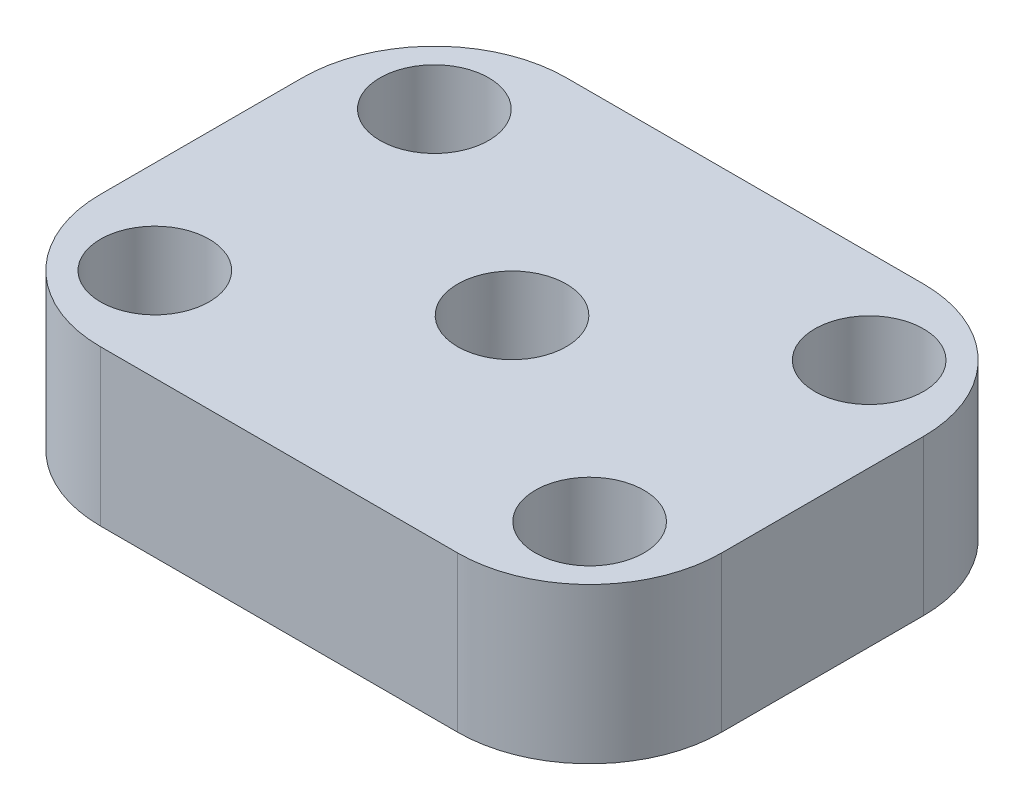
ISO-10303-21;
HEADER;
FILE_DESCRIPTION(('STEP AP214'),'2;1');
FILE_NAME('part.step','',(''),(''),'','','');
FILE_SCHEMA(('AUTOMOTIVE_DESIGN { 1 0 10303 214 1 1 1 1 }'));
ENDSEC;
DATA;
#1=APPLICATION_CONTEXT('core data for automotive mechanical design processes');
#2=APPLICATION_PROTOCOL_DEFINITION('international standard','automotive_design',2000,#1);
#3=PRODUCT_CONTEXT('',#1,'mechanical');
#4=PRODUCT('Part','Part','',(#3));
#5=PRODUCT_RELATED_PRODUCT_CATEGORY('part','',(#4));
#6=PRODUCT_DEFINITION_FORMATION('','',#4);
#7=PRODUCT_DEFINITION_CONTEXT('part definition',#1,'design');
#8=PRODUCT_DEFINITION('design','',#6,#7);
#9=PRODUCT_DEFINITION_SHAPE('','',#8);
#10=(LENGTH_UNIT() NAMED_UNIT(*) SI_UNIT(.MILLI.,.METRE.));
#11=(NAMED_UNIT(*) PLANE_ANGLE_UNIT() SI_UNIT($,.RADIAN.));
#12=(NAMED_UNIT(*) SI_UNIT($,.STERADIAN.) SOLID_ANGLE_UNIT());
#13=UNCERTAINTY_MEASURE_WITH_UNIT(LENGTH_MEASURE(1.E-05),#10,'distance_accuracy_value','');
#14=(GEOMETRIC_REPRESENTATION_CONTEXT(3) GLOBAL_UNCERTAINTY_ASSIGNED_CONTEXT((#13)) GLOBAL_UNIT_ASSIGNED_CONTEXT((#10,
#11,#12)) REPRESENTATION_CONTEXT('',''));
#15=CARTESIAN_POINT('',(0.,0.,0.));
#16=DIRECTION('',(0.,0.,1.));
#17=DIRECTION('',(1.,0.,0.));
#18=AXIS2_PLACEMENT_3D('',#15,#16,#17);
#19=CARTESIAN_POINT('',(14.,10.,-9.));
#20=DIRECTION('',(0.,1.,0.));
#21=DIRECTION('',(0.,0.,1.));
#22=AXIS2_PLACEMENT_3D('',#19,#20,#21);
#23=CYLINDRICAL_SURFACE('',#22,1.5);
#24=CARTESIAN_POINT('',(14.,0.,-9.));
#25=DIRECTION('',(0.,1.,0.));
#26=DIRECTION('',(0.,0.,1.));
#27=AXIS2_PLACEMENT_3D('',#24,#25,#26);
#28=CIRCLE('',#27,1.5);
#29=CARTESIAN_POINT('',(14.,0.,-7.5));
#30=VERTEX_POINT('',#29);
#31=EDGE_CURVE('E194',#30,#30,#28,.T.);
#32=ORIENTED_EDGE('',*,*,#31,.F.);
#33=EDGE_LOOP('',(#32));
#34=FACE_BOUND('',#33,.T.);
#35=CARTESIAN_POINT('',(14.,5.,-9.));
#36=DIRECTION('',(0.,1.,0.));
#37=DIRECTION('',(0.,0.,1.));
#38=AXIS2_PLACEMENT_3D('',#35,#36,#37);
#39=CIRCLE('',#38,1.5);
#40=CARTESIAN_POINT('',(14.,5.,-7.5));
#41=VERTEX_POINT('',#40);
#42=EDGE_CURVE('E37',#41,#41,#39,.F.);
#43=ORIENTED_EDGE('',*,*,#42,.F.);
#44=EDGE_LOOP('',(#43));
#45=FACE_BOUND('',#44,.T.);
#46=ADVANCED_FACE('F33',(#34,#45),#23,.F.);
#47=CARTESIAN_POINT('',(14.,10.,9.));
#48=DIRECTION('',(0.,1.,0.));
#49=DIRECTION('',(0.,0.,1.));
#50=AXIS2_PLACEMENT_3D('',#47,#48,#49);
#51=CYLINDRICAL_SURFACE('',#50,1.5);
#52=CARTESIAN_POINT('',(14.,0.,9.));
#53=DIRECTION('',(0.,1.,0.));
#54=DIRECTION('',(0.,0.,1.));
#55=AXIS2_PLACEMENT_3D('',#52,#53,#54);
#56=CIRCLE('',#55,1.5);
#57=CARTESIAN_POINT('',(14.,0.,10.5));
#58=VERTEX_POINT('',#57);
#59=EDGE_CURVE('E186',#58,#58,#56,.T.);
#60=ORIENTED_EDGE('',*,*,#59,.F.);
#61=EDGE_LOOP('',(#60));
#62=FACE_BOUND('',#61,.T.);
#63=CARTESIAN_POINT('',(14.,5.,9.));
#64=DIRECTION('',(0.,1.,0.));
#65=DIRECTION('',(0.,0.,1.));
#66=AXIS2_PLACEMENT_3D('',#63,#64,#65);
#67=CIRCLE('',#66,1.5);
#68=CARTESIAN_POINT('',(14.,5.,10.5));
#69=VERTEX_POINT('',#68);
#70=EDGE_CURVE('E172',#69,#69,#67,.F.);
#71=ORIENTED_EDGE('',*,*,#70,.F.);
#72=EDGE_LOOP('',(#71));
#73=FACE_BOUND('',#72,.T.);
#74=ADVANCED_FACE('F237',(#62,#73),#51,.F.);
#75=CARTESIAN_POINT('',(-14.,10.,9.));
#76=DIRECTION('',(0.,1.,0.));
#77=DIRECTION('',(0.,0.,1.));
#78=AXIS2_PLACEMENT_3D('',#75,#76,#77);
#79=CYLINDRICAL_SURFACE('',#78,1.5);
#80=CARTESIAN_POINT('',(-14.,0.,9.));
#81=DIRECTION('',(0.,1.,0.));
#82=DIRECTION('',(0.,0.,1.));
#83=AXIS2_PLACEMENT_3D('',#80,#81,#82);
#84=CIRCLE('',#83,1.5);
#85=CARTESIAN_POINT('',(-14.,0.,10.5));
#86=VERTEX_POINT('',#85);
#87=EDGE_CURVE('E181',#86,#86,#84,.T.);
#88=ORIENTED_EDGE('',*,*,#87,.F.);
#89=EDGE_LOOP('',(#88));
#90=FACE_BOUND('',#89,.T.);
#91=CARTESIAN_POINT('',(-14.,5.,9.));
#92=DIRECTION('',(0.,1.,0.));
#93=DIRECTION('',(0.,0.,1.));
#94=AXIS2_PLACEMENT_3D('',#91,#92,#93);
#95=CIRCLE('',#94,1.5);
#96=CARTESIAN_POINT('',(-14.,5.,10.5));
#97=VERTEX_POINT('',#96);
#98=EDGE_CURVE('E169',#97,#97,#95,.F.);
#99=ORIENTED_EDGE('',*,*,#98,.F.);
#100=EDGE_LOOP('',(#99));
#101=FACE_BOUND('',#100,.T.);
#102=ADVANCED_FACE('F243',(#90,#101),#79,.F.);
#103=CARTESIAN_POINT('',(-14.,10.,-9.));
#104=DIRECTION('',(0.,1.,0.));
#105=DIRECTION('',(0.,0.,1.));
#106=AXIS2_PLACEMENT_3D('',#103,#104,#105);
#107=CYLINDRICAL_SURFACE('',#106,1.5);
#108=CARTESIAN_POINT('',(-14.,0.,-9.));
#109=DIRECTION('',(0.,1.,0.));
#110=DIRECTION('',(0.,0.,1.));
#111=AXIS2_PLACEMENT_3D('',#108,#109,#110);
#112=CIRCLE('',#111,1.5);
#113=CARTESIAN_POINT('',(-14.,0.,-7.5));
#114=VERTEX_POINT('',#113);
#115=EDGE_CURVE('E177',#114,#114,#112,.T.);
#116=ORIENTED_EDGE('',*,*,#115,.F.);
#117=EDGE_LOOP('',(#116));
#118=FACE_BOUND('',#117,.T.);
#119=CARTESIAN_POINT('',(-14.,5.,-9.));
#120=DIRECTION('',(0.,1.,0.));
#121=DIRECTION('',(0.,0.,1.));
#122=AXIS2_PLACEMENT_3D('',#119,#120,#121);
#123=CIRCLE('',#122,1.5);
#124=CARTESIAN_POINT('',(-14.,5.,-7.5));
#125=VERTEX_POINT('',#124);
#126=EDGE_CURVE('E166',#125,#125,#123,.F.);
#127=ORIENTED_EDGE('',*,*,#126,.F.);
#128=EDGE_LOOP('',(#127));
#129=FACE_BOUND('',#128,.T.);
#130=ADVANCED_FACE('F275',(#118,#129),#107,.F.);
#131=CARTESIAN_POINT('',(20.,10.,-15.));
#132=DIRECTION('',(-1.,0.,0.));
#133=DIRECTION('',(0.,0.,1.));
#134=AXIS2_PLACEMENT_3D('',#131,#132,#133);
#135=PLANE('',#134);
#136=DIRECTION('',(0.,0.,-1.));
#137=VECTOR('',#136,1.);
#138=CARTESIAN_POINT('',(20.,0.,-15.));
#139=LINE('',#138,#137);
#140=CARTESIAN_POINT('',(20.,0.,6.5));
#141=VERTEX_POINT('',#140);
#142=CARTESIAN_POINT('',(20.,0.,-6.5));
#143=VERTEX_POINT('',#142);
#144=EDGE_CURVE('E128',#141,#143,#139,.T.);
#145=ORIENTED_EDGE('',*,*,#144,.T.);
#146=DIRECTION('',(0.,-1.,0.));
#147=VECTOR('',#146,1.);
#148=CARTESIAN_POINT('',(20.,10.,-6.5));
#149=LINE('',#148,#147);
#150=CARTESIAN_POINT('',(20.,10.,-6.5));
#151=VERTEX_POINT('',#150);
#152=EDGE_CURVE('E106',#143,#151,#149,.F.);
#153=ORIENTED_EDGE('',*,*,#152,.T.);
#154=DIRECTION('',(0.,0.,-1.));
#155=VECTOR('',#154,1.);
#156=CARTESIAN_POINT('',(20.,10.,-15.));
#157=LINE('',#156,#155);
#158=CARTESIAN_POINT('',(20.,10.,6.5));
#159=VERTEX_POINT('',#158);
#160=EDGE_CURVE('E138',#159,#151,#157,.T.);
#161=ORIENTED_EDGE('',*,*,#160,.F.);
#162=DIRECTION('',(0.,-1.,0.));
#163=VECTOR('',#162,1.);
#164=CARTESIAN_POINT('',(20.,10.,6.5));
#165=LINE('',#164,#163);
#166=EDGE_CURVE('E111',#159,#141,#165,.T.);
#167=ORIENTED_EDGE('',*,*,#166,.T.);
#168=EDGE_LOOP('',(#145,#153,#161,#167));
#169=FACE_BOUND('',#168,.T.);
#170=ADVANCED_FACE('F215',(#169),#135,.F.);
#171=CARTESIAN_POINT('',(-20.,10.,-15.));
#172=DIRECTION('',(0.,0.,1.));
#173=DIRECTION('',(1.,0.,0.));
#174=AXIS2_PLACEMENT_3D('',#171,#172,#173);
#175=PLANE('',#174);
#176=DIRECTION('',(-1.,0.,0.));
#177=VECTOR('',#176,1.);
#178=CARTESIAN_POINT('',(-20.,10.,-15.));
#179=LINE('',#178,#177);
#180=CARTESIAN_POINT('',(11.5,10.,-15.));
#181=VERTEX_POINT('',#180);
#182=CARTESIAN_POINT('',(-11.5,10.,-15.));
#183=VERTEX_POINT('',#182);
#184=EDGE_CURVE('E121',#181,#183,#179,.T.);
#185=ORIENTED_EDGE('',*,*,#184,.F.);
#186=DIRECTION('',(0.,-1.,0.));
#187=VECTOR('',#186,1.);
#188=CARTESIAN_POINT('',(11.5,10.,-15.));
#189=LINE('',#188,#187);
#190=CARTESIAN_POINT('',(11.5,0.,-15.));
#191=VERTEX_POINT('',#190);
#192=EDGE_CURVE('E105',#181,#191,#189,.T.);
#193=ORIENTED_EDGE('',*,*,#192,.T.);
#194=DIRECTION('',(-1.,0.,0.));
#195=VECTOR('',#194,1.);
#196=CARTESIAN_POINT('',(-20.,0.,-15.));
#197=LINE('',#196,#195);
#198=CARTESIAN_POINT('',(-11.5,0.,-15.));
#199=VERTEX_POINT('',#198);
#200=EDGE_CURVE('E118',#191,#199,#197,.T.);
#201=ORIENTED_EDGE('',*,*,#200,.T.);
#202=DIRECTION('',(0.,-1.,0.));
#203=VECTOR('',#202,1.);
#204=CARTESIAN_POINT('',(-11.5,10.,-15.));
#205=LINE('',#204,#203);
#206=EDGE_CURVE('E123',#199,#183,#205,.F.);
#207=ORIENTED_EDGE('',*,*,#206,.T.);
#208=EDGE_LOOP('',(#185,#193,#201,#207));
#209=FACE_BOUND('',#208,.T.);
#210=ADVANCED_FACE('F117',(#209),#175,.F.);
#211=CARTESIAN_POINT('',(-20.,10.,-15.));
#212=DIRECTION('',(1.,0.,0.));
#213=DIRECTION('',(0.,0.,-1.));
#214=AXIS2_PLACEMENT_3D('',#211,#212,#213);
#215=PLANE('',#214);
#216=DIRECTION('',(0.,0.,1.));
#217=VECTOR('',#216,1.);
#218=CARTESIAN_POINT('',(-20.,0.,-15.));
#219=LINE('',#218,#217);
#220=CARTESIAN_POINT('',(-20.,0.,-6.5));
#221=VERTEX_POINT('',#220);
#222=CARTESIAN_POINT('',(-20.,0.,6.5));
#223=VERTEX_POINT('',#222);
#224=EDGE_CURVE('E127',#221,#223,#219,.T.);
#225=ORIENTED_EDGE('',*,*,#224,.T.);
#226=DIRECTION('',(0.,-1.,0.));
#227=VECTOR('',#226,1.);
#228=CARTESIAN_POINT('',(-20.,10.,6.5));
#229=LINE('',#228,#227);
#230=CARTESIAN_POINT('',(-20.,10.,6.5));
#231=VERTEX_POINT('',#230);
#232=EDGE_CURVE('E11',#223,#231,#229,.F.);
#233=ORIENTED_EDGE('',*,*,#232,.T.);
#234=DIRECTION('',(0.,0.,1.));
#235=VECTOR('',#234,1.);
#236=CARTESIAN_POINT('',(-20.,10.,-15.));
#237=LINE('',#236,#235);
#238=CARTESIAN_POINT('',(-20.,10.,-6.5));
#239=VERTEX_POINT('',#238);
#240=EDGE_CURVE('E206',#239,#231,#237,.T.);
#241=ORIENTED_EDGE('',*,*,#240,.F.);
#242=DIRECTION('',(0.,-1.,0.));
#243=VECTOR('',#242,1.);
#244=CARTESIAN_POINT('',(-20.,10.,-6.5));
#245=LINE('',#244,#243);
#246=EDGE_CURVE('E42',#239,#221,#245,.T.);
#247=ORIENTED_EDGE('',*,*,#246,.T.);
#248=EDGE_LOOP('',(#225,#233,#241,#247));
#249=FACE_BOUND('',#248,.T.);
#250=ADVANCED_FACE('F222',(#249),#215,.F.);
#251=CARTESIAN_POINT('',(-20.,10.,15.));
#252=DIRECTION('',(0.,0.,-1.));
#253=DIRECTION('',(-1.,0.,0.));
#254=AXIS2_PLACEMENT_3D('',#251,#252,#253);
#255=PLANE('',#254);
#256=DIRECTION('',(1.,0.,0.));
#257=VECTOR('',#256,1.);
#258=CARTESIAN_POINT('',(-20.,0.,15.));
#259=LINE('',#258,#257);
#260=CARTESIAN_POINT('',(-11.5,0.,15.));
#261=VERTEX_POINT('',#260);
#262=CARTESIAN_POINT('',(11.5,0.,15.));
#263=VERTEX_POINT('',#262);
#264=EDGE_CURVE('E131',#261,#263,#259,.T.);
#265=ORIENTED_EDGE('',*,*,#264,.T.);
#266=DIRECTION('',(0.,-1.,0.));
#267=VECTOR('',#266,1.);
#268=CARTESIAN_POINT('',(11.5,10.,15.));
#269=LINE('',#268,#267);
#270=CARTESIAN_POINT('',(11.5,10.,15.));
#271=VERTEX_POINT('',#270);
#272=EDGE_CURVE('E50',#263,#271,#269,.F.);
#273=ORIENTED_EDGE('',*,*,#272,.T.);
#274=DIRECTION('',(1.,0.,0.));
#275=VECTOR('',#274,1.);
#276=CARTESIAN_POINT('',(-20.,10.,15.));
#277=LINE('',#276,#275);
#278=CARTESIAN_POINT('',(-11.5,10.,15.));
#279=VERTEX_POINT('',#278);
#280=EDGE_CURVE('E144',#279,#271,#277,.T.);
#281=ORIENTED_EDGE('',*,*,#280,.F.);
#282=DIRECTION('',(0.,-1.,0.));
#283=VECTOR('',#282,1.);
#284=CARTESIAN_POINT('',(-11.5,10.,15.));
#285=LINE('',#284,#283);
#286=EDGE_CURVE('E160',#279,#261,#285,.T.);
#287=ORIENTED_EDGE('',*,*,#286,.T.);
#288=EDGE_LOOP('',(#265,#273,#281,#287));
#289=FACE_BOUND('',#288,.T.);
#290=ADVANCED_FACE('F217',(#289),#255,.F.);
#291=CARTESIAN_POINT('',(0.,10.,0.));
#292=DIRECTION('',(0.,1.,0.));
#293=DIRECTION('',(0.,0.,1.));
#294=AXIS2_PLACEMENT_3D('',#291,#292,#293);
#295=PLANE('',#294);
#296=CARTESIAN_POINT('',(13.9999999999999,10.,-9.));
#297=DIRECTION('',(0.,1.,0.));
#298=DIRECTION('',(0.,0.,1.));
#299=AXIS2_PLACEMENT_3D('',#296,#297,#298);
#300=CIRCLE('',#299,3.5);
#301=CARTESIAN_POINT('',(13.9999999999999,10.,-5.5));
#302=VERTEX_POINT('',#301);
#303=EDGE_CURVE('E411',#302,#302,#300,.T.);
#304=ORIENTED_EDGE('',*,*,#303,.F.);
#305=EDGE_LOOP('',(#304));
#306=FACE_BOUND('',#305,.T.);
#307=CARTESIAN_POINT('',(-14.0000000000001,10.,-8.9999999999998));
#308=DIRECTION('',(0.,1.,0.));
#309=DIRECTION('',(0.,0.,1.));
#310=AXIS2_PLACEMENT_3D('',#307,#308,#309);
#311=CIRCLE('',#310,3.5);
#312=CARTESIAN_POINT('',(-14.0000000000001,10.,-5.49999999999981));
#313=VERTEX_POINT('',#312);
#314=EDGE_CURVE('E413',#313,#313,#311,.T.);
#315=ORIENTED_EDGE('',*,*,#314,.F.);
#316=EDGE_LOOP('',(#315));
#317=FACE_BOUND('',#316,.T.);
#318=CARTESIAN_POINT('',(-14.,10.,9.0000000000002));
#319=DIRECTION('',(0.,1.,0.));
#320=DIRECTION('',(0.,0.,1.));
#321=AXIS2_PLACEMENT_3D('',#318,#319,#320);
#322=CIRCLE('',#321,3.5);
#323=CARTESIAN_POINT('',(-14.,10.,12.5000000000002));
#324=VERTEX_POINT('',#323);
#325=EDGE_CURVE('E423',#324,#324,#322,.T.);
#326=ORIENTED_EDGE('',*,*,#325,.F.);
#327=EDGE_LOOP('',(#326));
#328=FACE_BOUND('',#327,.T.);
#329=CARTESIAN_POINT('',(14.,10.,9.));
#330=DIRECTION('',(0.,1.,0.));
#331=DIRECTION('',(0.,0.,1.));
#332=AXIS2_PLACEMENT_3D('',#329,#330,#331);
#333=CIRCLE('',#332,3.5);
#334=CARTESIAN_POINT('',(14.,10.,12.5));
#335=VERTEX_POINT('',#334);
#336=EDGE_CURVE('E189',#335,#335,#333,.T.);
#337=ORIENTED_EDGE('',*,*,#336,.F.);
#338=EDGE_LOOP('',(#337));
#339=FACE_BOUND('',#338,.T.);
#340=CARTESIAN_POINT('',(0.,10.,0.));
#341=DIRECTION('',(0.,1.,0.));
#342=DIRECTION('',(0.,0.,1.));
#343=AXIS2_PLACEMENT_3D('',#340,#341,#342);
#344=CIRCLE('',#343,3.5);
#345=CARTESIAN_POINT('',(0.,10.,3.5));
#346=VERTEX_POINT('',#345);
#347=EDGE_CURVE('E143',#346,#346,#344,.T.);
#348=ORIENTED_EDGE('',*,*,#347,.F.);
#349=EDGE_LOOP('',(#348));
#350=FACE_BOUND('',#349,.T.);
#351=ORIENTED_EDGE('',*,*,#160,.T.);
#352=CARTESIAN_POINT('',(11.5,10.,-6.5));
#353=DIRECTION('',(0.,1.,0.));
#354=DIRECTION('',(0.,0.,1.));
#355=AXIS2_PLACEMENT_3D('',#352,#353,#354);
#356=CIRCLE('',#355,8.5);
#357=EDGE_CURVE('E158',#151,#181,#356,.T.);
#358=ORIENTED_EDGE('',*,*,#357,.T.);
#359=ORIENTED_EDGE('',*,*,#184,.T.);
#360=CARTESIAN_POINT('',(-11.5,10.,-6.5));
#361=DIRECTION('',(0.,1.,0.));
#362=DIRECTION('',(0.,0.,1.));
#363=AXIS2_PLACEMENT_3D('',#360,#361,#362);
#364=CIRCLE('',#363,8.5);
#365=EDGE_CURVE('E153',#183,#239,#364,.T.);
#366=ORIENTED_EDGE('',*,*,#365,.T.);
#367=ORIENTED_EDGE('',*,*,#240,.T.);
#368=CARTESIAN_POINT('',(-11.5,10.,6.5));
#369=DIRECTION('',(0.,1.,0.));
#370=DIRECTION('',(0.,0.,1.));
#371=AXIS2_PLACEMENT_3D('',#368,#369,#370);
#372=CIRCLE('',#371,8.5);
#373=EDGE_CURVE('E57',#231,#279,#372,.T.);
#374=ORIENTED_EDGE('',*,*,#373,.T.);
#375=ORIENTED_EDGE('',*,*,#280,.T.);
#376=CARTESIAN_POINT('',(11.5,10.,6.5));
#377=DIRECTION('',(0.,1.,0.));
#378=DIRECTION('',(0.,0.,1.));
#379=AXIS2_PLACEMENT_3D('',#376,#377,#378);
#380=CIRCLE('',#379,8.5);
#381=EDGE_CURVE('E156',#271,#159,#380,.T.);
#382=ORIENTED_EDGE('',*,*,#381,.T.);
#383=EDGE_LOOP('',(#351,#358,#359,#366,#367,#374,#375,#382));
#384=FACE_BOUND('',#383,.T.);
#385=ADVANCED_FACE('F208',(#306,#317,#328,#339,#350,#384),#295,.T.);
#386=CARTESIAN_POINT('',(0.,0.,0.));
#387=DIRECTION('',(0.,1.,0.));
#388=DIRECTION('',(0.,0.,1.));
#389=AXIS2_PLACEMENT_3D('',#386,#387,#388);
#390=PLANE('',#389);
#391=ORIENTED_EDGE('',*,*,#115,.T.);
#392=EDGE_LOOP('',(#391));
#393=FACE_BOUND('',#392,.T.);
#394=ORIENTED_EDGE('',*,*,#87,.T.);
#395=EDGE_LOOP('',(#394));
#396=FACE_BOUND('',#395,.T.);
#397=ORIENTED_EDGE('',*,*,#59,.T.);
#398=EDGE_LOOP('',(#397));
#399=FACE_BOUND('',#398,.T.);
#400=ORIENTED_EDGE('',*,*,#31,.T.);
#401=EDGE_LOOP('',(#400));
#402=FACE_BOUND('',#401,.T.);
#403=CARTESIAN_POINT('',(0.,0.,0.));
#404=DIRECTION('',(0.,-1.,0.));
#405=DIRECTION('',(0.,0.,-1.));
#406=AXIS2_PLACEMENT_3D('',#403,#404,#405);
#407=CIRCLE('',#406,6.625);
#408=CARTESIAN_POINT('',(0.,0.,-6.625));
#409=VERTEX_POINT('',#408);
#410=EDGE_CURVE('E142',#409,#409,#407,.T.);
#411=ORIENTED_EDGE('',*,*,#410,.F.);
#412=EDGE_LOOP('',(#411));
#413=FACE_BOUND('',#412,.T.);
#414=ORIENTED_EDGE('',*,*,#200,.F.);
#415=CARTESIAN_POINT('',(11.5,0.,-6.5));
#416=DIRECTION('',(0.,1.,0.));
#417=DIRECTION('',(0.,0.,1.));
#418=AXIS2_PLACEMENT_3D('',#415,#416,#417);
#419=CIRCLE('',#418,8.5);
#420=EDGE_CURVE('E101',#191,#143,#419,.F.);
#421=ORIENTED_EDGE('',*,*,#420,.T.);
#422=ORIENTED_EDGE('',*,*,#144,.F.);
#423=CARTESIAN_POINT('',(11.5,0.,6.5));
#424=DIRECTION('',(0.,1.,0.));
#425=DIRECTION('',(0.,0.,1.));
#426=AXIS2_PLACEMENT_3D('',#423,#424,#425);
#427=CIRCLE('',#426,8.5);
#428=EDGE_CURVE('E112',#141,#263,#427,.F.);
#429=ORIENTED_EDGE('',*,*,#428,.T.);
#430=ORIENTED_EDGE('',*,*,#264,.F.);
#431=CARTESIAN_POINT('',(-11.5,0.,6.5));
#432=DIRECTION('',(0.,1.,0.));
#433=DIRECTION('',(0.,0.,1.));
#434=AXIS2_PLACEMENT_3D('',#431,#432,#433);
#435=CIRCLE('',#434,8.5);
#436=EDGE_CURVE('E147',#261,#223,#435,.F.);
#437=ORIENTED_EDGE('',*,*,#436,.T.);
#438=ORIENTED_EDGE('',*,*,#224,.F.);
#439=CARTESIAN_POINT('',(-11.5,0.,-6.5));
#440=DIRECTION('',(0.,1.,0.));
#441=DIRECTION('',(0.,0.,1.));
#442=AXIS2_PLACEMENT_3D('',#439,#440,#441);
#443=CIRCLE('',#442,8.5);
#444=EDGE_CURVE('E122',#221,#199,#443,.F.);
#445=ORIENTED_EDGE('',*,*,#444,.T.);
#446=EDGE_LOOP('',(#414,#421,#422,#429,#430,#437,#438,#445));
#447=FACE_BOUND('',#446,.T.);
#448=ADVANCED_FACE('F125',(#393,#396,#399,#402,#413,#447),#390,.F.);
#449=CARTESIAN_POINT('',(0.,4.5,0.));
#450=DIRECTION('',(0.,-1.,0.));
#451=DIRECTION('',(0.,0.,-1.));
#452=AXIS2_PLACEMENT_3D('',#449,#450,#451);
#453=CYLINDRICAL_SURFACE('',#452,6.625);
#454=CARTESIAN_POINT('',(0.,4.5,0.));
#455=DIRECTION('',(0.,-1.,0.));
#456=DIRECTION('',(0.,0.,-1.));
#457=AXIS2_PLACEMENT_3D('',#454,#455,#456);
#458=CIRCLE('',#457,6.625);
#459=CARTESIAN_POINT('',(0.,4.5,-6.625));
#460=VERTEX_POINT('',#459);
#461=EDGE_CURVE('E133',#460,#460,#458,.T.);
#462=ORIENTED_EDGE('',*,*,#461,.F.);
#463=EDGE_LOOP('',(#462));
#464=FACE_BOUND('',#463,.T.);
#465=ORIENTED_EDGE('',*,*,#410,.T.);
#466=EDGE_LOOP('',(#465));
#467=FACE_BOUND('',#466,.T.);
#468=ADVANCED_FACE('F257',(#464,#467),#453,.F.);
#469=CARTESIAN_POINT('',(0.,4.5,0.));
#470=DIRECTION('',(0.,-1.,0.));
#471=DIRECTION('',(0.,0.,-1.));
#472=AXIS2_PLACEMENT_3D('',#469,#470,#471);
#473=PLANE('',#472);
#474=CARTESIAN_POINT('',(0.,4.5,0.));
#475=DIRECTION('',(0.,-1.,0.));
#476=DIRECTION('',(0.,0.,-1.));
#477=AXIS2_PLACEMENT_3D('',#474,#475,#476);
#478=CIRCLE('',#477,3.5);
#479=CARTESIAN_POINT('',(0.,4.5,-3.5));
#480=VERTEX_POINT('',#479);
#481=EDGE_CURVE('E139',#480,#480,#478,.T.);
#482=ORIENTED_EDGE('',*,*,#481,.F.);
#483=EDGE_LOOP('',(#482));
#484=FACE_BOUND('',#483,.T.);
#485=ORIENTED_EDGE('',*,*,#461,.T.);
#486=EDGE_LOOP('',(#485));
#487=FACE_BOUND('',#486,.T.);
#488=ADVANCED_FACE('F253',(#484,#487),#473,.T.);
#489=CARTESIAN_POINT('',(0.,0.,0.));
#490=DIRECTION('',(0.,1.,0.));
#491=DIRECTION('',(0.,0.,1.));
#492=AXIS2_PLACEMENT_3D('',#489,#490,#491);
#493=CYLINDRICAL_SURFACE('',#492,3.5);
#494=ORIENTED_EDGE('',*,*,#481,.T.);
#495=EDGE_LOOP('',(#494));
#496=FACE_BOUND('',#495,.T.);
#497=ORIENTED_EDGE('',*,*,#347,.T.);
#498=EDGE_LOOP('',(#497));
#499=FACE_BOUND('',#498,.T.);
#500=ADVANCED_FACE('F250',(#496,#499),#493,.F.);
#501=CARTESIAN_POINT('',(11.5,10.,-6.5));
#502=DIRECTION('',(0.,-1.,0.));
#503=DIRECTION('',(0.,0.,-1.));
#504=AXIS2_PLACEMENT_3D('',#501,#502,#503);
#505=CYLINDRICAL_SURFACE('',#504,8.5);
#506=ORIENTED_EDGE('',*,*,#357,.F.);
#507=ORIENTED_EDGE('',*,*,#152,.F.);
#508=ORIENTED_EDGE('',*,*,#420,.F.);
#509=ORIENTED_EDGE('',*,*,#192,.F.);
#510=EDGE_LOOP('',(#506,#507,#508,#509));
#511=FACE_BOUND('',#510,.T.);
#512=ADVANCED_FACE('F104',(#511),#505,.T.);
#513=CARTESIAN_POINT('',(11.5,10.,6.5));
#514=DIRECTION('',(0.,-1.,0.));
#515=DIRECTION('',(0.,0.,-1.));
#516=AXIS2_PLACEMENT_3D('',#513,#514,#515);
#517=CYLINDRICAL_SURFACE('',#516,8.5);
#518=ORIENTED_EDGE('',*,*,#381,.F.);
#519=ORIENTED_EDGE('',*,*,#272,.F.);
#520=ORIENTED_EDGE('',*,*,#428,.F.);
#521=ORIENTED_EDGE('',*,*,#166,.F.);
#522=EDGE_LOOP('',(#518,#519,#520,#521));
#523=FACE_BOUND('',#522,.T.);
#524=ADVANCED_FACE('F213',(#523),#517,.T.);
#525=CARTESIAN_POINT('',(-11.5,10.,6.5));
#526=DIRECTION('',(0.,-1.,0.));
#527=DIRECTION('',(0.,0.,-1.));
#528=AXIS2_PLACEMENT_3D('',#525,#526,#527);
#529=CYLINDRICAL_SURFACE('',#528,8.5);
#530=ORIENTED_EDGE('',*,*,#373,.F.);
#531=ORIENTED_EDGE('',*,*,#232,.F.);
#532=ORIENTED_EDGE('',*,*,#436,.F.);
#533=ORIENTED_EDGE('',*,*,#286,.F.);
#534=EDGE_LOOP('',(#530,#531,#532,#533));
#535=FACE_BOUND('',#534,.T.);
#536=ADVANCED_FACE('F219',(#535),#529,.T.);
#537=CARTESIAN_POINT('',(-11.5,10.,-6.5));
#538=DIRECTION('',(0.,-1.,0.));
#539=DIRECTION('',(0.,0.,-1.));
#540=AXIS2_PLACEMENT_3D('',#537,#538,#539);
#541=CYLINDRICAL_SURFACE('',#540,8.5);
#542=ORIENTED_EDGE('',*,*,#365,.F.);
#543=ORIENTED_EDGE('',*,*,#206,.F.);
#544=ORIENTED_EDGE('',*,*,#444,.F.);
#545=ORIENTED_EDGE('',*,*,#246,.F.);
#546=EDGE_LOOP('',(#542,#543,#544,#545));
#547=FACE_BOUND('',#546,.T.);
#548=ADVANCED_FACE('F35',(#547),#541,.T.);
#549=CARTESIAN_POINT('',(-14.0000000000001,5.,-8.9999999999998));
#550=DIRECTION('',(0.,1.,0.));
#551=DIRECTION('',(0.,0.,1.));
#552=AXIS2_PLACEMENT_3D('',#549,#550,#551);
#553=PLANE('',#552);
#554=CARTESIAN_POINT('',(-14.0000000000001,5.,-8.9999999999998));
#555=DIRECTION('',(0.,1.,0.));
#556=DIRECTION('',(0.,0.,1.));
#557=AXIS2_PLACEMENT_3D('',#554,#555,#556);
#558=CIRCLE('',#557,3.5);
#559=CARTESIAN_POINT('',(-14.0000000000001,5.,-5.49999999999981));
#560=VERTEX_POINT('',#559);
#561=EDGE_CURVE('E427',#560,#560,#558,.T.);
#562=ORIENTED_EDGE('',*,*,#561,.T.);
#563=EDGE_LOOP('',(#562));
#564=FACE_BOUND('',#563,.T.);
#565=ORIENTED_EDGE('',*,*,#126,.T.);
#566=EDGE_LOOP('',(#565));
#567=FACE_BOUND('',#566,.T.);
#568=ADVANCED_FACE('F228',(#564,#567),#553,.T.);
#569=CARTESIAN_POINT('',(-14.0000000000001,5.,-8.9999999999998));
#570=DIRECTION('',(0.,1.,0.));
#571=DIRECTION('',(0.,0.,1.));
#572=AXIS2_PLACEMENT_3D('',#569,#570,#571);
#573=CYLINDRICAL_SURFACE('',#572,3.5);
#574=ORIENTED_EDGE('',*,*,#561,.F.);
#575=EDGE_LOOP('',(#574));
#576=FACE_BOUND('',#575,.T.);
#577=ORIENTED_EDGE('',*,*,#314,.T.);
#578=EDGE_LOOP('',(#577));
#579=FACE_BOUND('',#578,.T.);
#580=ADVANCED_FACE('F233',(#576,#579),#573,.F.);
#581=CARTESIAN_POINT('',(-14.,5.,9.0000000000002));
#582=DIRECTION('',(0.,1.,0.));
#583=DIRECTION('',(0.,0.,1.));
#584=AXIS2_PLACEMENT_3D('',#581,#582,#583);
#585=PLANE('',#584);
#586=CARTESIAN_POINT('',(-14.,5.,9.0000000000002));
#587=DIRECTION('',(0.,1.,0.));
#588=DIRECTION('',(0.,0.,1.));
#589=AXIS2_PLACEMENT_3D('',#586,#587,#588);
#590=CIRCLE('',#589,3.5);
#591=CARTESIAN_POINT('',(-14.,5.,12.5000000000002));
#592=VERTEX_POINT('',#591);
#593=EDGE_CURVE('E419',#592,#592,#590,.T.);
#594=ORIENTED_EDGE('',*,*,#593,.T.);
#595=EDGE_LOOP('',(#594));
#596=FACE_BOUND('',#595,.T.);
#597=ORIENTED_EDGE('',*,*,#98,.T.);
#598=EDGE_LOOP('',(#597));
#599=FACE_BOUND('',#598,.T.);
#600=ADVANCED_FACE('F341',(#596,#599),#585,.T.);
#601=CARTESIAN_POINT('',(-14.,5.,9.0000000000002));
#602=DIRECTION('',(0.,1.,0.));
#603=DIRECTION('',(0.,0.,1.));
#604=AXIS2_PLACEMENT_3D('',#601,#602,#603);
#605=CYLINDRICAL_SURFACE('',#604,3.5);
#606=ORIENTED_EDGE('',*,*,#593,.F.);
#607=EDGE_LOOP('',(#606));
#608=FACE_BOUND('',#607,.T.);
#609=ORIENTED_EDGE('',*,*,#325,.T.);
#610=EDGE_LOOP('',(#609));
#611=FACE_BOUND('',#610,.T.);
#612=ADVANCED_FACE('F351',(#608,#611),#605,.F.);
#613=CARTESIAN_POINT('',(14.,5.,9.));
#614=DIRECTION('',(0.,1.,0.));
#615=DIRECTION('',(0.,0.,1.));
#616=AXIS2_PLACEMENT_3D('',#613,#614,#615);
#617=PLANE('',#616);
#618=CARTESIAN_POINT('',(14.,5.,9.));
#619=DIRECTION('',(0.,1.,0.));
#620=DIRECTION('',(0.,0.,1.));
#621=AXIS2_PLACEMENT_3D('',#618,#619,#620);
#622=CIRCLE('',#621,3.5);
#623=CARTESIAN_POINT('',(14.,5.,12.5));
#624=VERTEX_POINT('',#623);
#625=EDGE_CURVE('E170',#624,#624,#622,.T.);
#626=ORIENTED_EDGE('',*,*,#625,.T.);
#627=EDGE_LOOP('',(#626));
#628=FACE_BOUND('',#627,.T.);
#629=ORIENTED_EDGE('',*,*,#70,.T.);
#630=EDGE_LOOP('',(#629));
#631=FACE_BOUND('',#630,.T.);
#632=ADVANCED_FACE('F361',(#628,#631),#617,.T.);
#633=CARTESIAN_POINT('',(14.,5.,9.));
#634=DIRECTION('',(0.,1.,0.));
#635=DIRECTION('',(0.,0.,1.));
#636=AXIS2_PLACEMENT_3D('',#633,#634,#635);
#637=CYLINDRICAL_SURFACE('',#636,3.5);
#638=ORIENTED_EDGE('',*,*,#625,.F.);
#639=EDGE_LOOP('',(#638));
#640=FACE_BOUND('',#639,.T.);
#641=ORIENTED_EDGE('',*,*,#336,.T.);
#642=EDGE_LOOP('',(#641));
#643=FACE_BOUND('',#642,.T.);
#644=ADVANCED_FACE('F371',(#640,#643),#637,.F.);
#645=CARTESIAN_POINT('',(13.9999999999999,5.,-9.));
#646=DIRECTION('',(0.,1.,0.));
#647=DIRECTION('',(0.,0.,1.));
#648=AXIS2_PLACEMENT_3D('',#645,#646,#647);
#649=PLANE('',#648);
#650=CARTESIAN_POINT('',(13.9999999999999,5.,-9.));
#651=DIRECTION('',(0.,1.,0.));
#652=DIRECTION('',(0.,0.,1.));
#653=AXIS2_PLACEMENT_3D('',#650,#651,#652);
#654=CIRCLE('',#653,3.5);
#655=CARTESIAN_POINT('',(13.9999999999999,5.,-5.5));
#656=VERTEX_POINT('',#655);
#657=EDGE_CURVE('E408',#656,#656,#654,.T.);
#658=ORIENTED_EDGE('',*,*,#657,.T.);
#659=EDGE_LOOP('',(#658));
#660=FACE_BOUND('',#659,.T.);
#661=ORIENTED_EDGE('',*,*,#42,.T.);
#662=EDGE_LOOP('',(#661));
#663=FACE_BOUND('',#662,.T.);
#664=ADVANCED_FACE('F381',(#660,#663),#649,.T.);
#665=CARTESIAN_POINT('',(13.9999999999999,5.,-9.));
#666=DIRECTION('',(0.,1.,0.));
#667=DIRECTION('',(0.,0.,1.));
#668=AXIS2_PLACEMENT_3D('',#665,#666,#667);
#669=CYLINDRICAL_SURFACE('',#668,3.5);
#670=ORIENTED_EDGE('',*,*,#657,.F.);
#671=EDGE_LOOP('',(#670));
#672=FACE_BOUND('',#671,.T.);
#673=ORIENTED_EDGE('',*,*,#303,.T.);
#674=EDGE_LOOP('',(#673));
#675=FACE_BOUND('',#674,.T.);
#676=ADVANCED_FACE('F391',(#672,#675),#669,.F.);
#677=CLOSED_SHELL('',(#46,#74,#102,#130,#170,#210,#250,#290,#385,#448,#468,#488,#500,#512,#524,
#536,#548,#568,#580,#600,#612,#632,#644,#664,#676));
#678=MANIFOLD_SOLID_BREP('B2',#677);
#679=ADVANCED_BREP_SHAPE_REPRESENTATION('',(#18,#678),#14);
#680=SHAPE_DEFINITION_REPRESENTATION(#9,#679);
ENDSEC;
END-ISO-10303-21;
